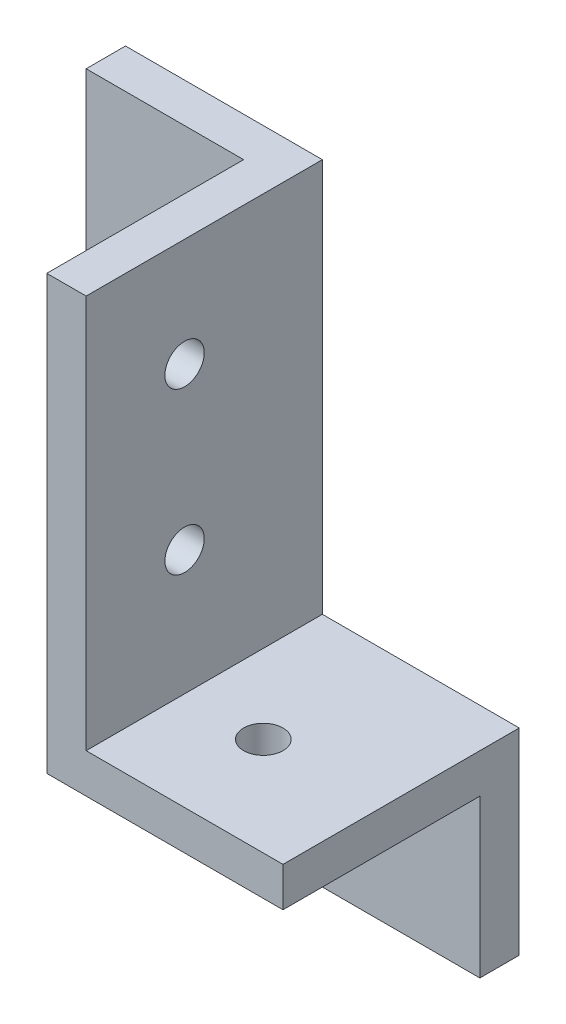
ISO-10303-21;
HEADER;
FILE_DESCRIPTION(('STEP AP214'),'2;1');
FILE_NAME('part.step','',(''),(''),'','','');
FILE_SCHEMA(('AUTOMOTIVE_DESIGN { 1 0 10303 214 1 1 1 1 }'));
ENDSEC;
DATA;
#1=APPLICATION_CONTEXT('core data for automotive mechanical design processes');
#2=APPLICATION_PROTOCOL_DEFINITION('international standard','automotive_design',2000,#1);
#3=PRODUCT_CONTEXT('',#1,'mechanical');
#4=PRODUCT('Part','Part','',(#3));
#5=PRODUCT_RELATED_PRODUCT_CATEGORY('part','',(#4));
#6=PRODUCT_DEFINITION_FORMATION('','',#4);
#7=PRODUCT_DEFINITION_CONTEXT('part definition',#1,'design');
#8=PRODUCT_DEFINITION('design','',#6,#7);
#9=PRODUCT_DEFINITION_SHAPE('','',#8);
#10=(LENGTH_UNIT() NAMED_UNIT(*) SI_UNIT(.MILLI.,.METRE.));
#11=(NAMED_UNIT(*) PLANE_ANGLE_UNIT() SI_UNIT($,.RADIAN.));
#12=(NAMED_UNIT(*) SI_UNIT($,.STERADIAN.) SOLID_ANGLE_UNIT());
#13=UNCERTAINTY_MEASURE_WITH_UNIT(LENGTH_MEASURE(1.E-05),#10,'distance_accuracy_value','');
#14=(GEOMETRIC_REPRESENTATION_CONTEXT(3) GLOBAL_UNCERTAINTY_ASSIGNED_CONTEXT((#13)) GLOBAL_UNIT_ASSIGNED_CONTEXT((#10,
#11,#12)) REPRESENTATION_CONTEXT('',''));
#15=CARTESIAN_POINT('',(0.,0.,0.));
#16=DIRECTION('',(0.,0.,1.));
#17=DIRECTION('',(1.,0.,0.));
#18=AXIS2_PLACEMENT_3D('',#15,#16,#17);
#19=CARTESIAN_POINT('',(0.,0.,10.));
#20=DIRECTION('',(0.,0.,-1.));
#21=DIRECTION('',(-1.,0.,0.));
#22=AXIS2_PLACEMENT_3D('',#19,#20,#21);
#23=PLANE('',#22);
#24=CARTESIAN_POINT('',(70.,20.,10.));
#25=DIRECTION('',(0.,0.,1.));
#26=DIRECTION('',(1.,0.,0.));
#27=AXIS2_PLACEMENT_3D('',#24,#25,#26);
#28=CIRCLE('',#27,5.);
#29=CARTESIAN_POINT('',(75.,20.,10.));
#30=VERTEX_POINT('',#29);
#31=EDGE_CURVE('E396',#30,#30,#28,.T.);
#32=ORIENTED_EDGE('',*,*,#31,.F.);
#33=EDGE_LOOP('',(#32));
#34=FACE_BOUND('',#33,.T.);
#35=CARTESIAN_POINT('',(20.,75.,10.));
#36=DIRECTION('',(0.,0.,1.));
#37=DIRECTION('',(1.,0.,0.));
#38=AXIS2_PLACEMENT_3D('',#35,#36,#37);
#39=CIRCLE('',#38,5.);
#40=CARTESIAN_POINT('',(25.,75.,10.));
#41=VERTEX_POINT('',#40);
#42=EDGE_CURVE('E402',#41,#41,#39,.T.);
#43=ORIENTED_EDGE('',*,*,#42,.F.);
#44=EDGE_LOOP('',(#43));
#45=FACE_BOUND('',#44,.T.);
#46=CARTESIAN_POINT('',(20.,120.,10.));
#47=DIRECTION('',(0.,0.,1.));
#48=DIRECTION('',(1.,0.,0.));
#49=AXIS2_PLACEMENT_3D('',#46,#47,#48);
#50=CIRCLE('',#49,5.);
#51=CARTESIAN_POINT('',(25.,120.,10.));
#52=VERTEX_POINT('',#51);
#53=EDGE_CURVE('E171',#52,#52,#50,.T.);
#54=ORIENTED_EDGE('',*,*,#53,.F.);
#55=EDGE_LOOP('',(#54));
#56=FACE_BOUND('',#55,.T.);
#57=CARTESIAN_POINT('',(20.,20.,10.));
#58=DIRECTION('',(0.,0.,1.));
#59=DIRECTION('',(1.,0.,0.));
#60=AXIS2_PLACEMENT_3D('',#57,#58,#59);
#61=CIRCLE('',#60,5.);
#62=CARTESIAN_POINT('',(25.,20.,10.));
#63=VERTEX_POINT('',#62);
#64=EDGE_CURVE('E163',#63,#63,#61,.T.);
#65=ORIENTED_EDGE('',*,*,#64,.F.);
#66=EDGE_LOOP('',(#65));
#67=FACE_BOUND('',#66,.T.);
#68=DIRECTION('',(1.,0.,0.));
#69=VECTOR('',#68,1.);
#70=CARTESIAN_POINT('',(40.,40.,10.));
#71=LINE('',#70,#69);
#72=CARTESIAN_POINT('',(40.,40.,10.));
#73=VERTEX_POINT('',#72);
#74=CARTESIAN_POINT('',(100.,40.,10.));
#75=VERTEX_POINT('',#74);
#76=EDGE_CURVE('E125',#73,#75,#71,.T.);
#77=ORIENTED_EDGE('',*,*,#76,.F.);
#78=DIRECTION('',(0.,-1.,0.));
#79=VECTOR('',#78,1.);
#80=CARTESIAN_POINT('',(40.,150.,10.));
#81=LINE('',#80,#79);
#82=CARTESIAN_POINT('',(40.,150.,10.));
#83=VERTEX_POINT('',#82);
#84=EDGE_CURVE('E50',#83,#73,#81,.T.);
#85=ORIENTED_EDGE('',*,*,#84,.F.);
#86=DIRECTION('',(-1.,0.,0.));
#87=VECTOR('',#86,1.);
#88=CARTESIAN_POINT('',(0.,150.,10.));
#89=LINE('',#88,#87);
#90=CARTESIAN_POINT('',(0.,150.,10.));
#91=VERTEX_POINT('',#90);
#92=EDGE_CURVE('E129',#83,#91,#89,.T.);
#93=ORIENTED_EDGE('',*,*,#92,.T.);
#94=DIRECTION('',(0.,-1.,0.));
#95=VECTOR('',#94,1.);
#96=CARTESIAN_POINT('',(0.,0.,10.));
#97=LINE('',#96,#95);
#98=CARTESIAN_POINT('',(0.,0.,10.));
#99=VERTEX_POINT('',#98);
#100=EDGE_CURVE('E148',#91,#99,#97,.T.);
#101=ORIENTED_EDGE('',*,*,#100,.T.);
#102=DIRECTION('',(1.,0.,0.));
#103=VECTOR('',#102,1.);
#104=CARTESIAN_POINT('',(0.,0.,10.));
#105=LINE('',#104,#103);
#106=CARTESIAN_POINT('',(100.,0.,10.));
#107=VERTEX_POINT('',#106);
#108=EDGE_CURVE('E151',#99,#107,#105,.T.);
#109=ORIENTED_EDGE('',*,*,#108,.T.);
#110=DIRECTION('',(0.,1.,0.));
#111=VECTOR('',#110,1.);
#112=CARTESIAN_POINT('',(100.,50.,10.));
#113=LINE('',#112,#111);
#114=EDGE_CURVE('E56',#107,#75,#113,.T.);
#115=ORIENTED_EDGE('',*,*,#114,.T.);
#116=EDGE_LOOP('',(#77,#85,#93,#101,#109,#115));
#117=FACE_BOUND('',#116,.T.);
#118=ADVANCED_FACE('F33',(#34,#45,#56,#67,#117),#23,.F.);
#119=CARTESIAN_POINT('',(0.,0.,10.));
#120=DIRECTION('',(1.,0.,0.));
#121=DIRECTION('',(0.,0.,-1.));
#122=AXIS2_PLACEMENT_3D('',#119,#120,#121);
#123=PLANE('',#122);
#124=DIRECTION('',(0.,-1.,0.));
#125=VECTOR('',#124,1.);
#126=CARTESIAN_POINT('',(0.,0.,0.));
#127=LINE('',#126,#125);
#128=CARTESIAN_POINT('',(0.,150.,0.));
#129=VERTEX_POINT('',#128);
#130=CARTESIAN_POINT('',(0.,0.,0.));
#131=VERTEX_POINT('',#130);
#132=EDGE_CURVE('E130',#129,#131,#127,.T.);
#133=ORIENTED_EDGE('',*,*,#132,.T.);
#134=DIRECTION('',(0.,0.,-1.));
#135=VECTOR('',#134,1.);
#136=CARTESIAN_POINT('',(0.,0.,10.));
#137=LINE('',#136,#135);
#138=EDGE_CURVE('E11',#99,#131,#137,.T.);
#139=ORIENTED_EDGE('',*,*,#138,.F.);
#140=ORIENTED_EDGE('',*,*,#100,.F.);
#141=DIRECTION('',(0.,0.,-1.));
#142=VECTOR('',#141,1.);
#143=CARTESIAN_POINT('',(0.,150.,10.));
#144=LINE('',#143,#142);
#145=EDGE_CURVE('E160',#91,#129,#144,.T.);
#146=ORIENTED_EDGE('',*,*,#145,.T.);
#147=EDGE_LOOP('',(#133,#139,#140,#146));
#148=FACE_BOUND('',#147,.T.);
#149=ADVANCED_FACE('F35',(#148),#123,.F.);
#150=CARTESIAN_POINT('',(0.,0.,10.));
#151=DIRECTION('',(0.,1.,0.));
#152=DIRECTION('',(0.,0.,1.));
#153=AXIS2_PLACEMENT_3D('',#150,#151,#152);
#154=PLANE('',#153);
#155=DIRECTION('',(1.,0.,0.));
#156=VECTOR('',#155,1.);
#157=CARTESIAN_POINT('',(0.,0.,0.));
#158=LINE('',#157,#156);
#159=CARTESIAN_POINT('',(100.,0.,0.));
#160=VERTEX_POINT('',#159);
#161=EDGE_CURVE('E133',#131,#160,#158,.T.);
#162=ORIENTED_EDGE('',*,*,#161,.T.);
#163=DIRECTION('',(0.,0.,-1.));
#164=VECTOR('',#163,1.);
#165=CARTESIAN_POINT('',(100.,0.,10.));
#166=LINE('',#165,#164);
#167=EDGE_CURVE('E42',#107,#160,#166,.T.);
#168=ORIENTED_EDGE('',*,*,#167,.F.);
#169=ORIENTED_EDGE('',*,*,#108,.F.);
#170=ORIENTED_EDGE('',*,*,#138,.T.);
#171=EDGE_LOOP('',(#162,#168,#169,#170));
#172=FACE_BOUND('',#171,.T.);
#173=ADVANCED_FACE('F195',(#172),#154,.F.);
#174=CARTESIAN_POINT('',(100.,50.,10.));
#175=DIRECTION('',(-1.,0.,0.));
#176=DIRECTION('',(0.,0.,1.));
#177=AXIS2_PLACEMENT_3D('',#174,#175,#176);
#178=PLANE('',#177);
#179=DIRECTION('',(0.,1.,0.));
#180=VECTOR('',#179,1.);
#181=CARTESIAN_POINT('',(100.,50.,0.));
#182=LINE('',#181,#180);
#183=CARTESIAN_POINT('',(100.,50.,0.));
#184=VERTEX_POINT('',#183);
#185=EDGE_CURVE('E225',#160,#184,#182,.T.);
#186=ORIENTED_EDGE('',*,*,#185,.T.);
#187=DIRECTION('',(0.,0.,-1.));
#188=VECTOR('',#187,1.);
#189=CARTESIAN_POINT('',(100.,50.,10.));
#190=LINE('',#189,#188);
#191=CARTESIAN_POINT('',(100.,50.,60.));
#192=VERTEX_POINT('',#191);
#193=EDGE_CURVE('E228',#192,#184,#190,.T.);
#194=ORIENTED_EDGE('',*,*,#193,.F.);
#195=DIRECTION('',(0.,1.,0.));
#196=VECTOR('',#195,1.);
#197=CARTESIAN_POINT('',(100.,40.,60.));
#198=LINE('',#197,#196);
#199=CARTESIAN_POINT('',(100.,40.,60.));
#200=VERTEX_POINT('',#199);
#201=EDGE_CURVE('E175',#200,#192,#198,.T.);
#202=ORIENTED_EDGE('',*,*,#201,.F.);
#203=DIRECTION('',(0.,0.,-1.));
#204=VECTOR('',#203,1.);
#205=CARTESIAN_POINT('',(100.,40.,60.));
#206=LINE('',#205,#204);
#207=EDGE_CURVE('E135',#200,#75,#206,.T.);
#208=ORIENTED_EDGE('',*,*,#207,.T.);
#209=ORIENTED_EDGE('',*,*,#114,.F.);
#210=ORIENTED_EDGE('',*,*,#167,.T.);
#211=EDGE_LOOP('',(#186,#194,#202,#208,#209,#210));
#212=FACE_BOUND('',#211,.T.);
#213=ADVANCED_FACE('F183',(#212),#178,.F.);
#214=CARTESIAN_POINT('',(50.,50.,10.));
#215=DIRECTION('',(0.,-1.,0.));
#216=DIRECTION('',(0.,0.,-1.));
#217=AXIS2_PLACEMENT_3D('',#214,#215,#216);
#218=PLANE('',#217);
#219=CARTESIAN_POINT('',(70.,50.,35.));
#220=DIRECTION('',(0.,-1.,0.));
#221=DIRECTION('',(0.,0.,-1.));
#222=AXIS2_PLACEMENT_3D('',#219,#220,#221);
#223=CIRCLE('',#222,5.00000000000001);
#224=CARTESIAN_POINT('',(70.,50.,30.));
#225=VERTEX_POINT('',#224);
#226=EDGE_CURVE('E379',#225,#225,#223,.T.);
#227=ORIENTED_EDGE('',*,*,#226,.T.);
#228=EDGE_LOOP('',(#227));
#229=FACE_BOUND('',#228,.T.);
#230=DIRECTION('',(-1.,0.,0.));
#231=VECTOR('',#230,1.);
#232=CARTESIAN_POINT('',(50.,50.,0.));
#233=LINE('',#232,#231);
#234=CARTESIAN_POINT('',(50.,50.,0.));
#235=VERTEX_POINT('',#234);
#236=EDGE_CURVE('E231',#184,#235,#233,.T.);
#237=ORIENTED_EDGE('',*,*,#236,.T.);
#238=DIRECTION('',(0.,0.,-1.));
#239=VECTOR('',#238,1.);
#240=CARTESIAN_POINT('',(50.,50.,10.));
#241=LINE('',#240,#239);
#242=CARTESIAN_POINT('',(50.,50.,60.));
#243=VERTEX_POINT('',#242);
#244=EDGE_CURVE('E242',#243,#235,#241,.T.);
#245=ORIENTED_EDGE('',*,*,#244,.F.);
#246=DIRECTION('',(-1.,0.,0.));
#247=VECTOR('',#246,1.);
#248=CARTESIAN_POINT('',(100.,50.,60.));
#249=LINE('',#248,#247);
#250=EDGE_CURVE('E177',#192,#243,#249,.T.);
#251=ORIENTED_EDGE('',*,*,#250,.F.);
#252=ORIENTED_EDGE('',*,*,#193,.T.);
#253=EDGE_LOOP('',(#237,#245,#251,#252));
#254=FACE_BOUND('',#253,.T.);
#255=ADVANCED_FACE('F210',(#229,#254),#218,.F.);
#256=CARTESIAN_POINT('',(50.,150.,10.));
#257=DIRECTION('',(-1.,0.,0.));
#258=DIRECTION('',(0.,0.,1.));
#259=AXIS2_PLACEMENT_3D('',#256,#257,#258);
#260=PLANE('',#259);
#261=CARTESIAN_POINT('',(50.,81.685491979389,35.));
#262=DIRECTION('',(-1.,0.,0.));
#263=DIRECTION('',(0.,-1.,0.));
#264=AXIS2_PLACEMENT_3D('',#261,#262,#263);
#265=CIRCLE('',#264,5.);
#266=CARTESIAN_POINT('',(50.,76.685491979389,35.));
#267=VERTEX_POINT('',#266);
#268=EDGE_CURVE('E387',#267,#267,#265,.T.);
#269=ORIENTED_EDGE('',*,*,#268,.T.);
#270=EDGE_LOOP('',(#269));
#271=FACE_BOUND('',#270,.T.);
#272=CARTESIAN_POINT('',(50.,122.555580900729,35.));
#273=DIRECTION('',(-1.,0.,0.));
#274=DIRECTION('',(0.,-1.,0.));
#275=AXIS2_PLACEMENT_3D('',#272,#273,#274);
#276=CIRCLE('',#275,5.);
#277=CARTESIAN_POINT('',(50.,117.555580900729,35.));
#278=VERTEX_POINT('',#277);
#279=EDGE_CURVE('E393',#278,#278,#276,.T.);
#280=ORIENTED_EDGE('',*,*,#279,.T.);
#281=EDGE_LOOP('',(#280));
#282=FACE_BOUND('',#281,.T.);
#283=DIRECTION('',(0.,1.,0.));
#284=VECTOR('',#283,1.);
#285=CARTESIAN_POINT('',(50.,150.,0.));
#286=LINE('',#285,#284);
#287=CARTESIAN_POINT('',(50.,150.,0.));
#288=VERTEX_POINT('',#287);
#289=EDGE_CURVE('E233',#235,#288,#286,.T.);
#290=ORIENTED_EDGE('',*,*,#289,.T.);
#291=DIRECTION('',(0.,0.,-1.));
#292=VECTOR('',#291,1.);
#293=CARTESIAN_POINT('',(50.,150.,10.));
#294=LINE('',#293,#292);
#295=CARTESIAN_POINT('',(50.,150.,60.));
#296=VERTEX_POINT('',#295);
#297=EDGE_CURVE('E240',#296,#288,#294,.T.);
#298=ORIENTED_EDGE('',*,*,#297,.F.);
#299=DIRECTION('',(0.,1.,0.));
#300=VECTOR('',#299,1.);
#301=CARTESIAN_POINT('',(50.,50.,60.));
#302=LINE('',#301,#300);
#303=EDGE_CURVE('E122',#243,#296,#302,.T.);
#304=ORIENTED_EDGE('',*,*,#303,.F.);
#305=ORIENTED_EDGE('',*,*,#244,.T.);
#306=EDGE_LOOP('',(#290,#298,#304,#305));
#307=FACE_BOUND('',#306,.T.);
#308=ADVANCED_FACE('F207',(#271,#282,#307),#260,.F.);
#309=CARTESIAN_POINT('',(0.,150.,10.));
#310=DIRECTION('',(0.,-1.,0.));
#311=DIRECTION('',(0.,0.,-1.));
#312=AXIS2_PLACEMENT_3D('',#309,#310,#311);
#313=PLANE('',#312);
#314=DIRECTION('',(-1.,0.,0.));
#315=VECTOR('',#314,1.);
#316=CARTESIAN_POINT('',(0.,150.,0.));
#317=LINE('',#316,#315);
#318=EDGE_CURVE('E152',#288,#129,#317,.T.);
#319=ORIENTED_EDGE('',*,*,#318,.T.);
#320=ORIENTED_EDGE('',*,*,#145,.F.);
#321=ORIENTED_EDGE('',*,*,#92,.F.);
#322=DIRECTION('',(0.,0.,-1.));
#323=VECTOR('',#322,1.);
#324=CARTESIAN_POINT('',(40.,150.,60.));
#325=LINE('',#324,#323);
#326=CARTESIAN_POINT('',(40.,150.,60.));
#327=VERTEX_POINT('',#326);
#328=EDGE_CURVE('E109',#327,#83,#325,.T.);
#329=ORIENTED_EDGE('',*,*,#328,.F.);
#330=DIRECTION('',(-1.,0.,0.));
#331=VECTOR('',#330,1.);
#332=CARTESIAN_POINT('',(50.,150.,60.));
#333=LINE('',#332,#331);
#334=EDGE_CURVE('E115',#296,#327,#333,.T.);
#335=ORIENTED_EDGE('',*,*,#334,.F.);
#336=ORIENTED_EDGE('',*,*,#297,.T.);
#337=EDGE_LOOP('',(#319,#320,#321,#329,#335,#336));
#338=FACE_BOUND('',#337,.T.);
#339=ADVANCED_FACE('F127',(#338),#313,.F.);
#340=CARTESIAN_POINT('',(0.,0.,0.));
#341=DIRECTION('',(0.,0.,-1.));
#342=DIRECTION('',(-1.,0.,0.));
#343=AXIS2_PLACEMENT_3D('',#340,#341,#342);
#344=PLANE('',#343);
#345=CARTESIAN_POINT('',(70.,20.,0.));
#346=DIRECTION('',(0.,0.,1.));
#347=DIRECTION('',(1.,0.,0.));
#348=AXIS2_PLACEMENT_3D('',#345,#346,#347);
#349=CIRCLE('',#348,5.);
#350=CARTESIAN_POINT('',(75.,20.,0.));
#351=VERTEX_POINT('',#350);
#352=EDGE_CURVE('E399',#351,#351,#349,.T.);
#353=ORIENTED_EDGE('',*,*,#352,.T.);
#354=EDGE_LOOP('',(#353));
#355=FACE_BOUND('',#354,.T.);
#356=CARTESIAN_POINT('',(20.,75.,0.));
#357=DIRECTION('',(0.,0.,1.));
#358=DIRECTION('',(1.,0.,0.));
#359=AXIS2_PLACEMENT_3D('',#356,#357,#358);
#360=CIRCLE('',#359,5.);
#361=CARTESIAN_POINT('',(25.,75.,0.));
#362=VERTEX_POINT('',#361);
#363=EDGE_CURVE('E405',#362,#362,#360,.T.);
#364=ORIENTED_EDGE('',*,*,#363,.T.);
#365=EDGE_LOOP('',(#364));
#366=FACE_BOUND('',#365,.T.);
#367=CARTESIAN_POINT('',(20.,120.,0.));
#368=DIRECTION('',(0.,0.,1.));
#369=DIRECTION('',(1.,0.,0.));
#370=AXIS2_PLACEMENT_3D('',#367,#368,#369);
#371=CIRCLE('',#370,5.);
#372=CARTESIAN_POINT('',(25.,120.,0.));
#373=VERTEX_POINT('',#372);
#374=EDGE_CURVE('E168',#373,#373,#371,.T.);
#375=ORIENTED_EDGE('',*,*,#374,.T.);
#376=EDGE_LOOP('',(#375));
#377=FACE_BOUND('',#376,.T.);
#378=CARTESIAN_POINT('',(20.,20.,0.));
#379=DIRECTION('',(0.,0.,1.));
#380=DIRECTION('',(1.,0.,0.));
#381=AXIS2_PLACEMENT_3D('',#378,#379,#380);
#382=CIRCLE('',#381,5.);
#383=CARTESIAN_POINT('',(25.,20.,0.));
#384=VERTEX_POINT('',#383);
#385=EDGE_CURVE('E161',#384,#384,#382,.T.);
#386=ORIENTED_EDGE('',*,*,#385,.T.);
#387=EDGE_LOOP('',(#386));
#388=FACE_BOUND('',#387,.T.);
#389=ORIENTED_EDGE('',*,*,#132,.F.);
#390=ORIENTED_EDGE('',*,*,#318,.F.);
#391=ORIENTED_EDGE('',*,*,#289,.F.);
#392=ORIENTED_EDGE('',*,*,#236,.F.);
#393=ORIENTED_EDGE('',*,*,#185,.F.);
#394=ORIENTED_EDGE('',*,*,#161,.F.);
#395=EDGE_LOOP('',(#389,#390,#391,#392,#393,#394));
#396=FACE_BOUND('',#395,.T.);
#397=ADVANCED_FACE('F202',(#355,#366,#377,#388,#396),#344,.T.);
#398=CARTESIAN_POINT('',(40.,150.,60.));
#399=DIRECTION('',(1.,0.,0.));
#400=DIRECTION('',(0.,1.,0.));
#401=AXIS2_PLACEMENT_3D('',#398,#399,#400);
#402=PLANE('',#401);
#403=CARTESIAN_POINT('',(40.,81.685491979389,35.));
#404=DIRECTION('',(-1.,0.,0.));
#405=DIRECTION('',(0.,-1.,0.));
#406=AXIS2_PLACEMENT_3D('',#403,#404,#405);
#407=CIRCLE('',#406,5.);
#408=CARTESIAN_POINT('',(40.,76.685491979389,35.));
#409=VERTEX_POINT('',#408);
#410=EDGE_CURVE('E384',#409,#409,#407,.T.);
#411=ORIENTED_EDGE('',*,*,#410,.F.);
#412=EDGE_LOOP('',(#411));
#413=FACE_BOUND('',#412,.T.);
#414=CARTESIAN_POINT('',(40.,122.555580900729,35.));
#415=DIRECTION('',(-1.,0.,0.));
#416=DIRECTION('',(0.,-1.,0.));
#417=AXIS2_PLACEMENT_3D('',#414,#415,#416);
#418=CIRCLE('',#417,5.);
#419=CARTESIAN_POINT('',(40.,117.555580900729,35.));
#420=VERTEX_POINT('',#419);
#421=EDGE_CURVE('E390',#420,#420,#418,.T.);
#422=ORIENTED_EDGE('',*,*,#421,.F.);
#423=EDGE_LOOP('',(#422));
#424=FACE_BOUND('',#423,.T.);
#425=ORIENTED_EDGE('',*,*,#84,.T.);
#426=DIRECTION('',(0.,0.,-1.));
#427=VECTOR('',#426,1.);
#428=CARTESIAN_POINT('',(40.,40.,60.));
#429=LINE('',#428,#427);
#430=CARTESIAN_POINT('',(40.,40.,60.));
#431=VERTEX_POINT('',#430);
#432=EDGE_CURVE('E111',#431,#73,#429,.T.);
#433=ORIENTED_EDGE('',*,*,#432,.F.);
#434=DIRECTION('',(0.,-1.,0.));
#435=VECTOR('',#434,1.);
#436=CARTESIAN_POINT('',(40.,150.,60.));
#437=LINE('',#436,#435);
#438=EDGE_CURVE('E105',#327,#431,#437,.T.);
#439=ORIENTED_EDGE('',*,*,#438,.F.);
#440=ORIENTED_EDGE('',*,*,#328,.T.);
#441=EDGE_LOOP('',(#425,#433,#439,#440));
#442=FACE_BOUND('',#441,.T.);
#443=ADVANCED_FACE('F107',(#413,#424,#442),#402,.F.);
#444=CARTESIAN_POINT('',(40.,40.,60.));
#445=DIRECTION('',(0.,1.,0.));
#446=DIRECTION('',(0.,0.,1.));
#447=AXIS2_PLACEMENT_3D('',#444,#445,#446);
#448=PLANE('',#447);
#449=CARTESIAN_POINT('',(70.,40.,35.));
#450=DIRECTION('',(0.,-1.,0.));
#451=DIRECTION('',(0.,0.,-1.));
#452=AXIS2_PLACEMENT_3D('',#449,#450,#451);
#453=CIRCLE('',#452,5.00000000000001);
#454=CARTESIAN_POINT('',(70.,40.,30.));
#455=VERTEX_POINT('',#454);
#456=EDGE_CURVE('E382',#455,#455,#453,.T.);
#457=ORIENTED_EDGE('',*,*,#456,.F.);
#458=EDGE_LOOP('',(#457));
#459=FACE_BOUND('',#458,.T.);
#460=ORIENTED_EDGE('',*,*,#76,.T.);
#461=ORIENTED_EDGE('',*,*,#207,.F.);
#462=DIRECTION('',(1.,0.,0.));
#463=VECTOR('',#462,1.);
#464=CARTESIAN_POINT('',(40.,40.,60.));
#465=LINE('',#464,#463);
#466=EDGE_CURVE('E114',#431,#200,#465,.T.);
#467=ORIENTED_EDGE('',*,*,#466,.F.);
#468=ORIENTED_EDGE('',*,*,#432,.T.);
#469=EDGE_LOOP('',(#460,#461,#467,#468));
#470=FACE_BOUND('',#469,.T.);
#471=ADVANCED_FACE('F186',(#459,#470),#448,.F.);
#472=CARTESIAN_POINT('',(0.,0.,60.));
#473=DIRECTION('',(0.,0.,1.));
#474=DIRECTION('',(1.,0.,0.));
#475=AXIS2_PLACEMENT_3D('',#472,#473,#474);
#476=PLANE('',#475);
#477=ORIENTED_EDGE('',*,*,#334,.T.);
#478=ORIENTED_EDGE('',*,*,#438,.T.);
#479=ORIENTED_EDGE('',*,*,#466,.T.);
#480=ORIENTED_EDGE('',*,*,#201,.T.);
#481=ORIENTED_EDGE('',*,*,#250,.T.);
#482=ORIENTED_EDGE('',*,*,#303,.T.);
#483=EDGE_LOOP('',(#477,#478,#479,#480,#481,#482));
#484=FACE_BOUND('',#483,.T.);
#485=ADVANCED_FACE('F119',(#484),#476,.T.);
#486=CARTESIAN_POINT('',(20.,20.,0.));
#487=DIRECTION('',(0.,0.,1.));
#488=DIRECTION('',(1.,0.,0.));
#489=AXIS2_PLACEMENT_3D('',#486,#487,#488);
#490=CYLINDRICAL_SURFACE('',#489,5.);
#491=ORIENTED_EDGE('',*,*,#385,.F.);
#492=EDGE_LOOP('',(#491));
#493=FACE_BOUND('',#492,.T.);
#494=ORIENTED_EDGE('',*,*,#64,.T.);
#495=EDGE_LOOP('',(#494));
#496=FACE_BOUND('',#495,.T.);
#497=ADVANCED_FACE('F308',(#493,#496),#490,.F.);
#498=CARTESIAN_POINT('',(20.,120.,0.));
#499=DIRECTION('',(0.,0.,1.));
#500=DIRECTION('',(1.,0.,0.));
#501=AXIS2_PLACEMENT_3D('',#498,#499,#500);
#502=CYLINDRICAL_SURFACE('',#501,5.);
#503=ORIENTED_EDGE('',*,*,#374,.F.);
#504=EDGE_LOOP('',(#503));
#505=FACE_BOUND('',#504,.T.);
#506=ORIENTED_EDGE('',*,*,#53,.T.);
#507=EDGE_LOOP('',(#506));
#508=FACE_BOUND('',#507,.T.);
#509=ADVANCED_FACE('F313',(#505,#508),#502,.F.);
#510=CARTESIAN_POINT('',(20.,75.,0.));
#511=DIRECTION('',(0.,0.,1.));
#512=DIRECTION('',(1.,0.,0.));
#513=AXIS2_PLACEMENT_3D('',#510,#511,#512);
#514=CYLINDRICAL_SURFACE('',#513,5.);
#515=ORIENTED_EDGE('',*,*,#363,.F.);
#516=EDGE_LOOP('',(#515));
#517=FACE_BOUND('',#516,.T.);
#518=ORIENTED_EDGE('',*,*,#42,.T.);
#519=EDGE_LOOP('',(#518));
#520=FACE_BOUND('',#519,.T.);
#521=ADVANCED_FACE('F321',(#517,#520),#514,.F.);
#522=CARTESIAN_POINT('',(70.,20.,0.));
#523=DIRECTION('',(0.,0.,1.));
#524=DIRECTION('',(1.,0.,0.));
#525=AXIS2_PLACEMENT_3D('',#522,#523,#524);
#526=CYLINDRICAL_SURFACE('',#525,5.);
#527=ORIENTED_EDGE('',*,*,#352,.F.);
#528=EDGE_LOOP('',(#527));
#529=FACE_BOUND('',#528,.T.);
#530=ORIENTED_EDGE('',*,*,#31,.T.);
#531=EDGE_LOOP('',(#530));
#532=FACE_BOUND('',#531,.T.);
#533=ADVANCED_FACE('F329',(#529,#532),#526,.F.);
#534=CARTESIAN_POINT('',(50.,122.555580900729,35.));
#535=DIRECTION('',(-1.,0.,0.));
#536=DIRECTION('',(0.,-1.,0.));
#537=AXIS2_PLACEMENT_3D('',#534,#535,#536);
#538=CYLINDRICAL_SURFACE('',#537,5.);
#539=ORIENTED_EDGE('',*,*,#279,.F.);
#540=EDGE_LOOP('',(#539));
#541=FACE_BOUND('',#540,.T.);
#542=ORIENTED_EDGE('',*,*,#421,.T.);
#543=EDGE_LOOP('',(#542));
#544=FACE_BOUND('',#543,.T.);
#545=ADVANCED_FACE('F336',(#541,#544),#538,.F.);
#546=CARTESIAN_POINT('',(50.,81.685491979389,35.));
#547=DIRECTION('',(-1.,0.,0.));
#548=DIRECTION('',(0.,-1.,0.));
#549=AXIS2_PLACEMENT_3D('',#546,#547,#548);
#550=CYLINDRICAL_SURFACE('',#549,5.);
#551=ORIENTED_EDGE('',*,*,#268,.F.);
#552=EDGE_LOOP('',(#551));
#553=FACE_BOUND('',#552,.T.);
#554=ORIENTED_EDGE('',*,*,#410,.T.);
#555=EDGE_LOOP('',(#554));
#556=FACE_BOUND('',#555,.T.);
#557=ADVANCED_FACE('F343',(#553,#556),#550,.F.);
#558=CARTESIAN_POINT('',(70.,50.,35.));
#559=DIRECTION('',(0.,-1.,0.));
#560=DIRECTION('',(0.,0.,-1.));
#561=AXIS2_PLACEMENT_3D('',#558,#559,#560);
#562=CYLINDRICAL_SURFACE('',#561,5.00000000000001);
#563=ORIENTED_EDGE('',*,*,#226,.F.);
#564=EDGE_LOOP('',(#563));
#565=FACE_BOUND('',#564,.T.);
#566=ORIENTED_EDGE('',*,*,#456,.T.);
#567=EDGE_LOOP('',(#566));
#568=FACE_BOUND('',#567,.T.);
#569=ADVANCED_FACE('F350',(#565,#568),#562,.F.);
#570=CLOSED_SHELL('',(#118,#149,#173,#213,#255,#308,#339,#397,#443,#471,#485,#497,#509,#521,
#533,#545,#557,#569));
#571=MANIFOLD_SOLID_BREP('B2',#570);
#572=ADVANCED_BREP_SHAPE_REPRESENTATION('',(#18,#571),#14);
#573=SHAPE_DEFINITION_REPRESENTATION(#9,#572);
ENDSEC;
END-ISO-10303-21;
